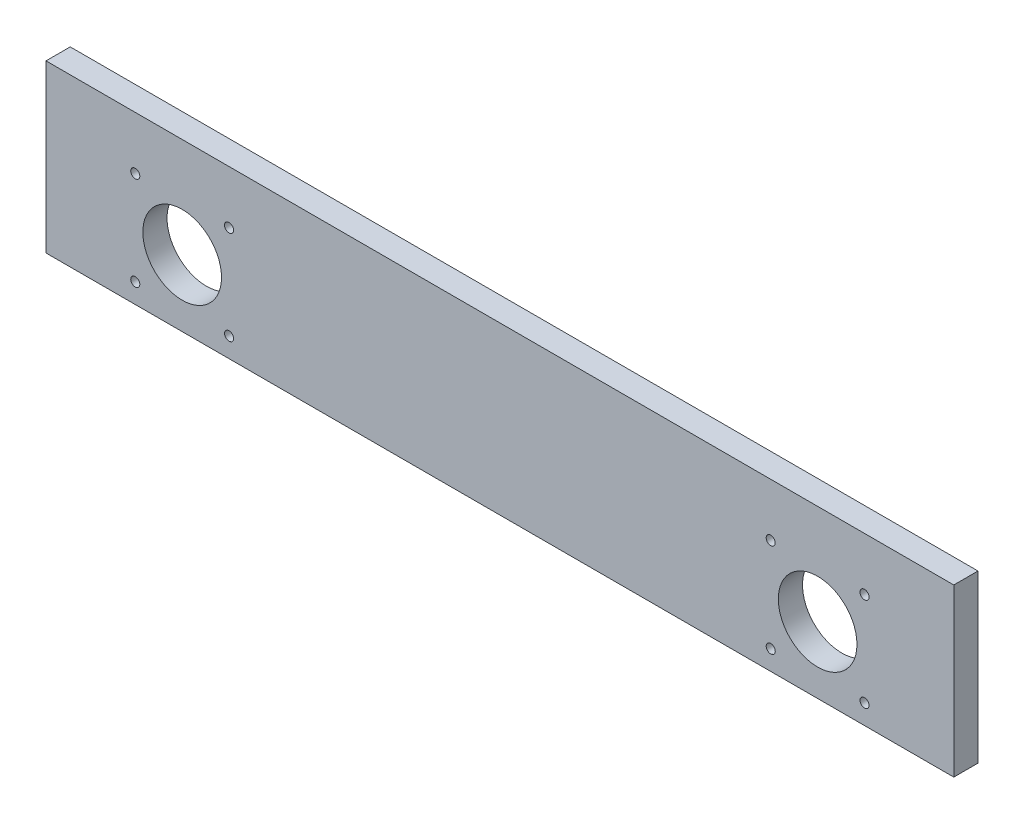
ISO-10303-21;
HEADER;
FILE_DESCRIPTION(('STEP AP214'),'2;1');
FILE_NAME('part.step','',(''),(''),'','','');
FILE_SCHEMA(('AUTOMOTIVE_DESIGN { 1 0 10303 214 1 1 1 1 }'));
ENDSEC;
DATA;
#1=APPLICATION_CONTEXT('core data for automotive mechanical design processes');
#2=APPLICATION_PROTOCOL_DEFINITION('international standard','automotive_design',2000,#1);
#3=PRODUCT_CONTEXT('',#1,'mechanical');
#4=PRODUCT('Part','Part','',(#3));
#5=PRODUCT_RELATED_PRODUCT_CATEGORY('part','',(#4));
#6=PRODUCT_DEFINITION_FORMATION('','',#4);
#7=PRODUCT_DEFINITION_CONTEXT('part definition',#1,'design');
#8=PRODUCT_DEFINITION('design','',#6,#7);
#9=PRODUCT_DEFINITION_SHAPE('','',#8);
#10=(LENGTH_UNIT() NAMED_UNIT(*) SI_UNIT(.MILLI.,.METRE.));
#11=(NAMED_UNIT(*) PLANE_ANGLE_UNIT() SI_UNIT($,.RADIAN.));
#12=(NAMED_UNIT(*) SI_UNIT($,.STERADIAN.) SOLID_ANGLE_UNIT());
#13=UNCERTAINTY_MEASURE_WITH_UNIT(LENGTH_MEASURE(1.E-05),#10,'distance_accuracy_value','');
#14=(GEOMETRIC_REPRESENTATION_CONTEXT(3) GLOBAL_UNCERTAINTY_ASSIGNED_CONTEXT((#13)) GLOBAL_UNIT_ASSIGNED_CONTEXT((#10,
#11,#12)) REPRESENTATION_CONTEXT('',''));
#15=CARTESIAN_POINT('',(0.,0.,0.));
#16=DIRECTION('',(0.,0.,1.));
#17=DIRECTION('',(1.,0.,0.));
#18=AXIS2_PLACEMENT_3D('',#15,#16,#17);
#19=CARTESIAN_POINT('',(-150.,55.,-4.));
#20=DIRECTION('',(0.,0.,1.));
#21=DIRECTION('',(1.,0.,0.));
#22=AXIS2_PLACEMENT_3D('',#19,#20,#21);
#23=PLANE('',#22);
#24=DIRECTION('',(0.,1.,0.));
#25=VECTOR('',#24,1.);
#26=CARTESIAN_POINT('',(-150.,55.,-4.));
#27=LINE('',#26,#25);
#28=CARTESIAN_POINT('',(-150.,0.,-4.));
#29=VERTEX_POINT('',#28);
#30=CARTESIAN_POINT('',(-150.,55.,-4.));
#31=VERTEX_POINT('',#30);
#32=EDGE_CURVE('E58',#29,#31,#27,.T.);
#33=ORIENTED_EDGE('',*,*,#32,.T.);
#34=DIRECTION('',(1.,0.,0.));
#35=VECTOR('',#34,1.);
#36=CARTESIAN_POINT('',(0.,55.,-4.));
#37=LINE('',#36,#35);
#38=CARTESIAN_POINT('',(150.,55.,-4.));
#39=VERTEX_POINT('',#38);
#40=EDGE_CURVE('E55',#31,#39,#37,.T.);
#41=ORIENTED_EDGE('',*,*,#40,.T.);
#42=DIRECTION('',(0.,1.,0.));
#43=VECTOR('',#42,1.);
#44=CARTESIAN_POINT('',(150.,55.,-4.));
#45=LINE('',#44,#43);
#46=CARTESIAN_POINT('',(150.,0.,-4.));
#47=VERTEX_POINT('',#46);
#48=EDGE_CURVE('E350',#39,#47,#45,.F.);
#49=ORIENTED_EDGE('',*,*,#48,.T.);
#50=DIRECTION('',(1.,0.,0.));
#51=VECTOR('',#50,1.);
#52=CARTESIAN_POINT('',(0.,0.,-4.));
#53=LINE('',#52,#51);
#54=EDGE_CURVE('E60',#29,#47,#53,.T.);
#55=ORIENTED_EDGE('',*,*,#54,.F.);
#56=EDGE_LOOP('',(#33,#41,#49,#55));
#57=FACE_BOUND('',#56,.T.);
#58=CARTESIAN_POINT('',(-105.,22.,-4.));
#59=DIRECTION('',(0.,0.,1.));
#60=DIRECTION('',(1.,0.,0.));
#61=AXIS2_PLACEMENT_3D('',#58,#59,#60);
#62=CIRCLE('',#61,13.);
#63=CARTESIAN_POINT('',(-92.,22.,-4.));
#64=VERTEX_POINT('',#63);
#65=EDGE_CURVE('E66',#64,#64,#62,.T.);
#66=ORIENTED_EDGE('',*,*,#65,.T.);
#67=EDGE_LOOP('',(#66));
#68=FACE_BOUND('',#67,.T.);
#69=CARTESIAN_POINT('',(105.,22.,-4.));
#70=DIRECTION('',(0.,0.,1.));
#71=DIRECTION('',(1.,0.,0.));
#72=AXIS2_PLACEMENT_3D('',#69,#70,#71);
#73=CIRCLE('',#72,13.);
#74=CARTESIAN_POINT('',(118.,22.,-4.));
#75=VERTEX_POINT('',#74);
#76=EDGE_CURVE('E113',#75,#75,#73,.T.);
#77=ORIENTED_EDGE('',*,*,#76,.T.);
#78=EDGE_LOOP('',(#77));
#79=FACE_BOUND('',#78,.T.);
#80=CARTESIAN_POINT('',(-89.5,6.5,-4.));
#81=DIRECTION('',(0.,0.,1.));
#82=DIRECTION('',(1.,0.,0.));
#83=AXIS2_PLACEMENT_3D('',#80,#81,#82);
#84=CIRCLE('',#83,1.5);
#85=CARTESIAN_POINT('',(-88.,6.5,-4.));
#86=VERTEX_POINT('',#85);
#87=EDGE_CURVE('E116',#86,#86,#84,.T.);
#88=ORIENTED_EDGE('',*,*,#87,.T.);
#89=EDGE_LOOP('',(#88));
#90=FACE_BOUND('',#89,.T.);
#91=CARTESIAN_POINT('',(-89.5,37.5,-4.));
#92=DIRECTION('',(0.,0.,1.));
#93=DIRECTION('',(1.,0.,0.));
#94=AXIS2_PLACEMENT_3D('',#91,#92,#93);
#95=CIRCLE('',#94,1.5);
#96=CARTESIAN_POINT('',(-88.,37.5,-4.));
#97=VERTEX_POINT('',#96);
#98=EDGE_CURVE('E119',#97,#97,#95,.T.);
#99=ORIENTED_EDGE('',*,*,#98,.T.);
#100=EDGE_LOOP('',(#99));
#101=FACE_BOUND('',#100,.T.);
#102=CARTESIAN_POINT('',(120.5,6.5,-4.));
#103=DIRECTION('',(0.,0.,1.));
#104=DIRECTION('',(1.,0.,0.));
#105=AXIS2_PLACEMENT_3D('',#102,#103,#104);
#106=CIRCLE('',#105,1.5);
#107=CARTESIAN_POINT('',(122.,6.5,-4.));
#108=VERTEX_POINT('',#107);
#109=EDGE_CURVE('E122',#108,#108,#106,.T.);
#110=ORIENTED_EDGE('',*,*,#109,.T.);
#111=EDGE_LOOP('',(#110));
#112=FACE_BOUND('',#111,.T.);
#113=CARTESIAN_POINT('',(-120.5,37.5,-4.));
#114=DIRECTION('',(0.,0.,1.));
#115=DIRECTION('',(1.,0.,0.));
#116=AXIS2_PLACEMENT_3D('',#113,#114,#115);
#117=CIRCLE('',#116,1.5);
#118=CARTESIAN_POINT('',(-119.,37.5,-4.));
#119=VERTEX_POINT('',#118);
#120=EDGE_CURVE('E125',#119,#119,#117,.T.);
#121=ORIENTED_EDGE('',*,*,#120,.T.);
#122=EDGE_LOOP('',(#121));
#123=FACE_BOUND('',#122,.T.);
#124=CARTESIAN_POINT('',(-120.5,6.5,-4.));
#125=DIRECTION('',(0.,0.,1.));
#126=DIRECTION('',(1.,0.,0.));
#127=AXIS2_PLACEMENT_3D('',#124,#125,#126);
#128=CIRCLE('',#127,1.5);
#129=CARTESIAN_POINT('',(-119.,6.5,-4.));
#130=VERTEX_POINT('',#129);
#131=EDGE_CURVE('E128',#130,#130,#128,.T.);
#132=ORIENTED_EDGE('',*,*,#131,.T.);
#133=EDGE_LOOP('',(#132));
#134=FACE_BOUND('',#133,.T.);
#135=CARTESIAN_POINT('',(89.5,6.5,-4.));
#136=DIRECTION('',(0.,0.,1.));
#137=DIRECTION('',(1.,0.,0.));
#138=AXIS2_PLACEMENT_3D('',#135,#136,#137);
#139=CIRCLE('',#138,1.5);
#140=CARTESIAN_POINT('',(91.,6.5,-4.));
#141=VERTEX_POINT('',#140);
#142=EDGE_CURVE('E131',#141,#141,#139,.T.);
#143=ORIENTED_EDGE('',*,*,#142,.T.);
#144=EDGE_LOOP('',(#143));
#145=FACE_BOUND('',#144,.T.);
#146=CARTESIAN_POINT('',(89.5,37.5,-4.));
#147=DIRECTION('',(0.,0.,1.));
#148=DIRECTION('',(1.,0.,0.));
#149=AXIS2_PLACEMENT_3D('',#146,#147,#148);
#150=CIRCLE('',#149,1.5);
#151=CARTESIAN_POINT('',(91.,37.5,-4.));
#152=VERTEX_POINT('',#151);
#153=EDGE_CURVE('E133',#152,#152,#150,.T.);
#154=ORIENTED_EDGE('',*,*,#153,.T.);
#155=EDGE_LOOP('',(#154));
#156=FACE_BOUND('',#155,.T.);
#157=CARTESIAN_POINT('',(120.5,37.5,-4.));
#158=DIRECTION('',(0.,0.,1.));
#159=DIRECTION('',(1.,0.,0.));
#160=AXIS2_PLACEMENT_3D('',#157,#158,#159);
#161=CIRCLE('',#160,1.5);
#162=CARTESIAN_POINT('',(122.,37.5,-4.));
#163=VERTEX_POINT('',#162);
#164=EDGE_CURVE('E20',#163,#163,#161,.T.);
#165=ORIENTED_EDGE('',*,*,#164,.T.);
#166=EDGE_LOOP('',(#165));
#167=FACE_BOUND('',#166,.T.);
#168=ADVANCED_FACE('F17',(#57,#68,#79,#90,#101,#112,#123,#134,#145,#156,#167),#23,.F.);
#169=CARTESIAN_POINT('',(120.5,37.5,-4.));
#170=DIRECTION('',(0.,0.,1.));
#171=DIRECTION('',(1.,0.,0.));
#172=AXIS2_PLACEMENT_3D('',#169,#170,#171);
#173=CYLINDRICAL_SURFACE('',#172,1.5);
#174=ORIENTED_EDGE('',*,*,#164,.F.);
#175=EDGE_LOOP('',(#174));
#176=FACE_BOUND('',#175,.T.);
#177=CARTESIAN_POINT('',(120.5,37.5,4.));
#178=DIRECTION('',(0.,0.,1.));
#179=DIRECTION('',(1.,0.,0.));
#180=AXIS2_PLACEMENT_3D('',#177,#178,#179);
#181=CIRCLE('',#180,1.5);
#182=CARTESIAN_POINT('',(122.,37.5,4.));
#183=VERTEX_POINT('',#182);
#184=EDGE_CURVE('E108',#183,#183,#181,.T.);
#185=ORIENTED_EDGE('',*,*,#184,.T.);
#186=EDGE_LOOP('',(#185));
#187=FACE_BOUND('',#186,.T.);
#188=ADVANCED_FACE('F141',(#176,#187),#173,.F.);
#189=CARTESIAN_POINT('',(89.5,37.5,-4.));
#190=DIRECTION('',(0.,0.,1.));
#191=DIRECTION('',(1.,0.,0.));
#192=AXIS2_PLACEMENT_3D('',#189,#190,#191);
#193=CYLINDRICAL_SURFACE('',#192,1.5);
#194=ORIENTED_EDGE('',*,*,#153,.F.);
#195=EDGE_LOOP('',(#194));
#196=FACE_BOUND('',#195,.T.);
#197=CARTESIAN_POINT('',(89.5,37.5,4.));
#198=DIRECTION('',(0.,0.,1.));
#199=DIRECTION('',(1.,0.,0.));
#200=AXIS2_PLACEMENT_3D('',#197,#198,#199);
#201=CIRCLE('',#200,1.5);
#202=CARTESIAN_POINT('',(91.,37.5,4.));
#203=VERTEX_POINT('',#202);
#204=EDGE_CURVE('E105',#203,#203,#201,.T.);
#205=ORIENTED_EDGE('',*,*,#204,.T.);
#206=EDGE_LOOP('',(#205));
#207=FACE_BOUND('',#206,.T.);
#208=ADVANCED_FACE('F144',(#196,#207),#193,.F.);
#209=CARTESIAN_POINT('',(89.5,6.5,-4.));
#210=DIRECTION('',(0.,0.,1.));
#211=DIRECTION('',(1.,0.,0.));
#212=AXIS2_PLACEMENT_3D('',#209,#210,#211);
#213=CYLINDRICAL_SURFACE('',#212,1.5);
#214=ORIENTED_EDGE('',*,*,#142,.F.);
#215=EDGE_LOOP('',(#214));
#216=FACE_BOUND('',#215,.T.);
#217=CARTESIAN_POINT('',(89.5,6.5,4.));
#218=DIRECTION('',(0.,0.,1.));
#219=DIRECTION('',(1.,0.,0.));
#220=AXIS2_PLACEMENT_3D('',#217,#218,#219);
#221=CIRCLE('',#220,1.5);
#222=CARTESIAN_POINT('',(91.,6.5,4.));
#223=VERTEX_POINT('',#222);
#224=EDGE_CURVE('E102',#223,#223,#221,.T.);
#225=ORIENTED_EDGE('',*,*,#224,.T.);
#226=EDGE_LOOP('',(#225));
#227=FACE_BOUND('',#226,.T.);
#228=ADVANCED_FACE('F195',(#216,#227),#213,.F.);
#229=CARTESIAN_POINT('',(-120.5,6.5,-4.));
#230=DIRECTION('',(0.,0.,1.));
#231=DIRECTION('',(1.,0.,0.));
#232=AXIS2_PLACEMENT_3D('',#229,#230,#231);
#233=CYLINDRICAL_SURFACE('',#232,1.5);
#234=ORIENTED_EDGE('',*,*,#131,.F.);
#235=EDGE_LOOP('',(#234));
#236=FACE_BOUND('',#235,.T.);
#237=CARTESIAN_POINT('',(-120.5,6.5,4.));
#238=DIRECTION('',(0.,0.,1.));
#239=DIRECTION('',(1.,0.,0.));
#240=AXIS2_PLACEMENT_3D('',#237,#238,#239);
#241=CIRCLE('',#240,1.5);
#242=CARTESIAN_POINT('',(-119.,6.5,4.));
#243=VERTEX_POINT('',#242);
#244=EDGE_CURVE('E99',#243,#243,#241,.T.);
#245=ORIENTED_EDGE('',*,*,#244,.T.);
#246=EDGE_LOOP('',(#245));
#247=FACE_BOUND('',#246,.T.);
#248=ADVANCED_FACE('F191',(#236,#247),#233,.F.);
#249=CARTESIAN_POINT('',(-120.5,37.5,-4.));
#250=DIRECTION('',(0.,0.,1.));
#251=DIRECTION('',(1.,0.,0.));
#252=AXIS2_PLACEMENT_3D('',#249,#250,#251);
#253=CYLINDRICAL_SURFACE('',#252,1.5);
#254=ORIENTED_EDGE('',*,*,#120,.F.);
#255=EDGE_LOOP('',(#254));
#256=FACE_BOUND('',#255,.T.);
#257=CARTESIAN_POINT('',(-120.5,37.5,4.));
#258=DIRECTION('',(0.,0.,1.));
#259=DIRECTION('',(1.,0.,0.));
#260=AXIS2_PLACEMENT_3D('',#257,#258,#259);
#261=CIRCLE('',#260,1.5);
#262=CARTESIAN_POINT('',(-119.,37.5,4.));
#263=VERTEX_POINT('',#262);
#264=EDGE_CURVE('E96',#263,#263,#261,.T.);
#265=ORIENTED_EDGE('',*,*,#264,.T.);
#266=EDGE_LOOP('',(#265));
#267=FACE_BOUND('',#266,.T.);
#268=ADVANCED_FACE('F187',(#256,#267),#253,.F.);
#269=CARTESIAN_POINT('',(120.5,6.5,-4.));
#270=DIRECTION('',(0.,0.,1.));
#271=DIRECTION('',(1.,0.,0.));
#272=AXIS2_PLACEMENT_3D('',#269,#270,#271);
#273=CYLINDRICAL_SURFACE('',#272,1.5);
#274=ORIENTED_EDGE('',*,*,#109,.F.);
#275=EDGE_LOOP('',(#274));
#276=FACE_BOUND('',#275,.T.);
#277=CARTESIAN_POINT('',(120.5,6.5,4.));
#278=DIRECTION('',(0.,0.,1.));
#279=DIRECTION('',(1.,0.,0.));
#280=AXIS2_PLACEMENT_3D('',#277,#278,#279);
#281=CIRCLE('',#280,1.5);
#282=CARTESIAN_POINT('',(122.,6.5,4.));
#283=VERTEX_POINT('',#282);
#284=EDGE_CURVE('E93',#283,#283,#281,.T.);
#285=ORIENTED_EDGE('',*,*,#284,.T.);
#286=EDGE_LOOP('',(#285));
#287=FACE_BOUND('',#286,.T.);
#288=ADVANCED_FACE('F183',(#276,#287),#273,.F.);
#289=CARTESIAN_POINT('',(-89.5,37.5,-4.));
#290=DIRECTION('',(0.,0.,1.));
#291=DIRECTION('',(1.,0.,0.));
#292=AXIS2_PLACEMENT_3D('',#289,#290,#291);
#293=CYLINDRICAL_SURFACE('',#292,1.5);
#294=ORIENTED_EDGE('',*,*,#98,.F.);
#295=EDGE_LOOP('',(#294));
#296=FACE_BOUND('',#295,.T.);
#297=CARTESIAN_POINT('',(-89.5,37.5,4.));
#298=DIRECTION('',(0.,0.,1.));
#299=DIRECTION('',(1.,0.,0.));
#300=AXIS2_PLACEMENT_3D('',#297,#298,#299);
#301=CIRCLE('',#300,1.5);
#302=CARTESIAN_POINT('',(-88.,37.5,4.));
#303=VERTEX_POINT('',#302);
#304=EDGE_CURVE('E90',#303,#303,#301,.T.);
#305=ORIENTED_EDGE('',*,*,#304,.T.);
#306=EDGE_LOOP('',(#305));
#307=FACE_BOUND('',#306,.T.);
#308=ADVANCED_FACE('F179',(#296,#307),#293,.F.);
#309=CARTESIAN_POINT('',(-89.5,6.5,-4.));
#310=DIRECTION('',(0.,0.,1.));
#311=DIRECTION('',(1.,0.,0.));
#312=AXIS2_PLACEMENT_3D('',#309,#310,#311);
#313=CYLINDRICAL_SURFACE('',#312,1.5);
#314=ORIENTED_EDGE('',*,*,#87,.F.);
#315=EDGE_LOOP('',(#314));
#316=FACE_BOUND('',#315,.T.);
#317=CARTESIAN_POINT('',(-89.5,6.5,4.));
#318=DIRECTION('',(0.,0.,1.));
#319=DIRECTION('',(1.,0.,0.));
#320=AXIS2_PLACEMENT_3D('',#317,#318,#319);
#321=CIRCLE('',#320,1.5);
#322=CARTESIAN_POINT('',(-88.,6.5,4.));
#323=VERTEX_POINT('',#322);
#324=EDGE_CURVE('E87',#323,#323,#321,.T.);
#325=ORIENTED_EDGE('',*,*,#324,.T.);
#326=EDGE_LOOP('',(#325));
#327=FACE_BOUND('',#326,.T.);
#328=ADVANCED_FACE('F175',(#316,#327),#313,.F.);
#329=CARTESIAN_POINT('',(105.,22.,-4.));
#330=DIRECTION('',(0.,0.,1.));
#331=DIRECTION('',(1.,0.,0.));
#332=AXIS2_PLACEMENT_3D('',#329,#330,#331);
#333=CYLINDRICAL_SURFACE('',#332,13.);
#334=ORIENTED_EDGE('',*,*,#76,.F.);
#335=EDGE_LOOP('',(#334));
#336=FACE_BOUND('',#335,.T.);
#337=CARTESIAN_POINT('',(105.,22.,4.));
#338=DIRECTION('',(0.,0.,1.));
#339=DIRECTION('',(1.,0.,0.));
#340=AXIS2_PLACEMENT_3D('',#337,#338,#339);
#341=CIRCLE('',#340,13.);
#342=CARTESIAN_POINT('',(118.,22.,4.));
#343=VERTEX_POINT('',#342);
#344=EDGE_CURVE('E84',#343,#343,#341,.T.);
#345=ORIENTED_EDGE('',*,*,#344,.T.);
#346=EDGE_LOOP('',(#345));
#347=FACE_BOUND('',#346,.T.);
#348=ADVANCED_FACE('F171',(#336,#347),#333,.F.);
#349=CARTESIAN_POINT('',(-105.,22.,-4.));
#350=DIRECTION('',(0.,0.,1.));
#351=DIRECTION('',(1.,0.,0.));
#352=AXIS2_PLACEMENT_3D('',#349,#350,#351);
#353=CYLINDRICAL_SURFACE('',#352,13.);
#354=ORIENTED_EDGE('',*,*,#65,.F.);
#355=EDGE_LOOP('',(#354));
#356=FACE_BOUND('',#355,.T.);
#357=CARTESIAN_POINT('',(-105.,22.,4.));
#358=DIRECTION('',(0.,0.,1.));
#359=DIRECTION('',(1.,0.,0.));
#360=AXIS2_PLACEMENT_3D('',#357,#358,#359);
#361=CIRCLE('',#360,13.);
#362=CARTESIAN_POINT('',(-92.,22.,4.));
#363=VERTEX_POINT('',#362);
#364=EDGE_CURVE('E81',#363,#363,#361,.T.);
#365=ORIENTED_EDGE('',*,*,#364,.T.);
#366=EDGE_LOOP('',(#365));
#367=FACE_BOUND('',#366,.T.);
#368=ADVANCED_FACE('F168',(#356,#367),#353,.F.);
#369=CARTESIAN_POINT('',(-150.,55.,4.));
#370=DIRECTION('',(1.,0.,0.));
#371=DIRECTION('',(0.,0.,-1.));
#372=AXIS2_PLACEMENT_3D('',#369,#370,#371);
#373=PLANE('',#372);
#374=DIRECTION('',(0.,1.,0.));
#375=VECTOR('',#374,1.);
#376=CARTESIAN_POINT('',(-150.,55.,4.));
#377=LINE('',#376,#375);
#378=CARTESIAN_POINT('',(-150.,0.,4.));
#379=VERTEX_POINT('',#378);
#380=CARTESIAN_POINT('',(-150.,55.,4.));
#381=VERTEX_POINT('',#380);
#382=EDGE_CURVE('E77',#379,#381,#377,.T.);
#383=ORIENTED_EDGE('',*,*,#382,.T.);
#384=DIRECTION('',(0.,0.,-1.));
#385=VECTOR('',#384,1.);
#386=CARTESIAN_POINT('',(-150.,55.,0.));
#387=LINE('',#386,#385);
#388=EDGE_CURVE('E65',#381,#31,#387,.T.);
#389=ORIENTED_EDGE('',*,*,#388,.T.);
#390=ORIENTED_EDGE('',*,*,#32,.F.);
#391=DIRECTION('',(0.,0.,-1.));
#392=VECTOR('',#391,1.);
#393=CARTESIAN_POINT('',(-150.,0.,0.));
#394=LINE('',#393,#392);
#395=EDGE_CURVE('E353',#379,#29,#394,.T.);
#396=ORIENTED_EDGE('',*,*,#395,.F.);
#397=EDGE_LOOP('',(#383,#389,#390,#396));
#398=FACE_BOUND('',#397,.T.);
#399=ADVANCED_FACE('F76',(#398),#373,.F.);
#400=CARTESIAN_POINT('',(0.,55.,0.));
#401=DIRECTION('',(0.,-1.,0.));
#402=DIRECTION('',(0.,0.,-1.));
#403=AXIS2_PLACEMENT_3D('',#400,#401,#402);
#404=PLANE('',#403);
#405=ORIENTED_EDGE('',*,*,#40,.F.);
#406=ORIENTED_EDGE('',*,*,#388,.F.);
#407=DIRECTION('',(-1.,0.,0.));
#408=VECTOR('',#407,1.);
#409=CARTESIAN_POINT('',(-150.,55.,4.));
#410=LINE('',#409,#408);
#411=CARTESIAN_POINT('',(150.,55.,4.));
#412=VERTEX_POINT('',#411);
#413=EDGE_CURVE('E359',#381,#412,#410,.F.);
#414=ORIENTED_EDGE('',*,*,#413,.T.);
#415=DIRECTION('',(0.,0.,1.));
#416=VECTOR('',#415,1.);
#417=CARTESIAN_POINT('',(150.,55.,4.));
#418=LINE('',#417,#416);
#419=EDGE_CURVE('E73',#412,#39,#418,.F.);
#420=ORIENTED_EDGE('',*,*,#419,.T.);
#421=EDGE_LOOP('',(#405,#406,#414,#420));
#422=FACE_BOUND('',#421,.T.);
#423=ADVANCED_FACE('F70',(#422),#404,.F.);
#424=CARTESIAN_POINT('',(150.,55.,4.));
#425=DIRECTION('',(-1.,0.,0.));
#426=DIRECTION('',(0.,0.,1.));
#427=AXIS2_PLACEMENT_3D('',#424,#425,#426);
#428=PLANE('',#427);
#429=ORIENTED_EDGE('',*,*,#48,.F.);
#430=ORIENTED_EDGE('',*,*,#419,.F.);
#431=DIRECTION('',(0.,1.,0.));
#432=VECTOR('',#431,1.);
#433=CARTESIAN_POINT('',(150.,55.,4.));
#434=LINE('',#433,#432);
#435=CARTESIAN_POINT('',(150.,0.,4.));
#436=VERTEX_POINT('',#435);
#437=EDGE_CURVE('E26',#412,#436,#434,.F.);
#438=ORIENTED_EDGE('',*,*,#437,.T.);
#439=DIRECTION('',(0.,0.,-1.));
#440=VECTOR('',#439,1.);
#441=CARTESIAN_POINT('',(150.,0.,0.));
#442=LINE('',#441,#440);
#443=EDGE_CURVE('E34',#47,#436,#442,.F.);
#444=ORIENTED_EDGE('',*,*,#443,.F.);
#445=EDGE_LOOP('',(#429,#430,#438,#444));
#446=FACE_BOUND('',#445,.T.);
#447=ADVANCED_FACE('F156',(#446),#428,.F.);
#448=CARTESIAN_POINT('',(0.,0.,0.));
#449=DIRECTION('',(0.,-1.,0.));
#450=DIRECTION('',(0.,0.,-1.));
#451=AXIS2_PLACEMENT_3D('',#448,#449,#450);
#452=PLANE('',#451);
#453=ORIENTED_EDGE('',*,*,#395,.T.);
#454=ORIENTED_EDGE('',*,*,#54,.T.);
#455=ORIENTED_EDGE('',*,*,#443,.T.);
#456=DIRECTION('',(-1.,0.,0.));
#457=VECTOR('',#456,1.);
#458=CARTESIAN_POINT('',(-150.,0.,4.));
#459=LINE('',#458,#457);
#460=EDGE_CURVE('E11',#436,#379,#459,.T.);
#461=ORIENTED_EDGE('',*,*,#460,.T.);
#462=EDGE_LOOP('',(#453,#454,#455,#461));
#463=FACE_BOUND('',#462,.T.);
#464=ADVANCED_FACE('F149',(#463),#452,.T.);
#465=CARTESIAN_POINT('',(-150.,55.,4.));
#466=DIRECTION('',(0.,0.,-1.));
#467=DIRECTION('',(-1.,0.,0.));
#468=AXIS2_PLACEMENT_3D('',#465,#466,#467);
#469=PLANE('',#468);
#470=ORIENTED_EDGE('',*,*,#437,.F.);
#471=ORIENTED_EDGE('',*,*,#413,.F.);
#472=ORIENTED_EDGE('',*,*,#382,.F.);
#473=ORIENTED_EDGE('',*,*,#460,.F.);
#474=EDGE_LOOP('',(#470,#471,#472,#473));
#475=FACE_BOUND('',#474,.T.);
#476=ORIENTED_EDGE('',*,*,#364,.F.);
#477=EDGE_LOOP('',(#476));
#478=FACE_BOUND('',#477,.T.);
#479=ORIENTED_EDGE('',*,*,#344,.F.);
#480=EDGE_LOOP('',(#479));
#481=FACE_BOUND('',#480,.T.);
#482=ORIENTED_EDGE('',*,*,#324,.F.);
#483=EDGE_LOOP('',(#482));
#484=FACE_BOUND('',#483,.T.);
#485=ORIENTED_EDGE('',*,*,#304,.F.);
#486=EDGE_LOOP('',(#485));
#487=FACE_BOUND('',#486,.T.);
#488=ORIENTED_EDGE('',*,*,#284,.F.);
#489=EDGE_LOOP('',(#488));
#490=FACE_BOUND('',#489,.T.);
#491=ORIENTED_EDGE('',*,*,#264,.F.);
#492=EDGE_LOOP('',(#491));
#493=FACE_BOUND('',#492,.T.);
#494=ORIENTED_EDGE('',*,*,#244,.F.);
#495=EDGE_LOOP('',(#494));
#496=FACE_BOUND('',#495,.T.);
#497=ORIENTED_EDGE('',*,*,#224,.F.);
#498=EDGE_LOOP('',(#497));
#499=FACE_BOUND('',#498,.T.);
#500=ORIENTED_EDGE('',*,*,#204,.F.);
#501=EDGE_LOOP('',(#500));
#502=FACE_BOUND('',#501,.T.);
#503=ORIENTED_EDGE('',*,*,#184,.F.);
#504=EDGE_LOOP('',(#503));
#505=FACE_BOUND('',#504,.T.);
#506=ADVANCED_FACE('F147',(#475,#478,#481,#484,#487,#490,#493,#496,#499,#502,#505),#469,.F.);
#507=CLOSED_SHELL('',(#168,#188,#208,#228,#248,#268,#288,#308,#328,#348,#368,#399,#423,#447,
#464,#506));
#508=MANIFOLD_SOLID_BREP('B1',#507);
#509=ADVANCED_BREP_SHAPE_REPRESENTATION('',(#18,#508),#14);
#510=SHAPE_DEFINITION_REPRESENTATION(#9,#509);
ENDSEC;
END-ISO-10303-21;
